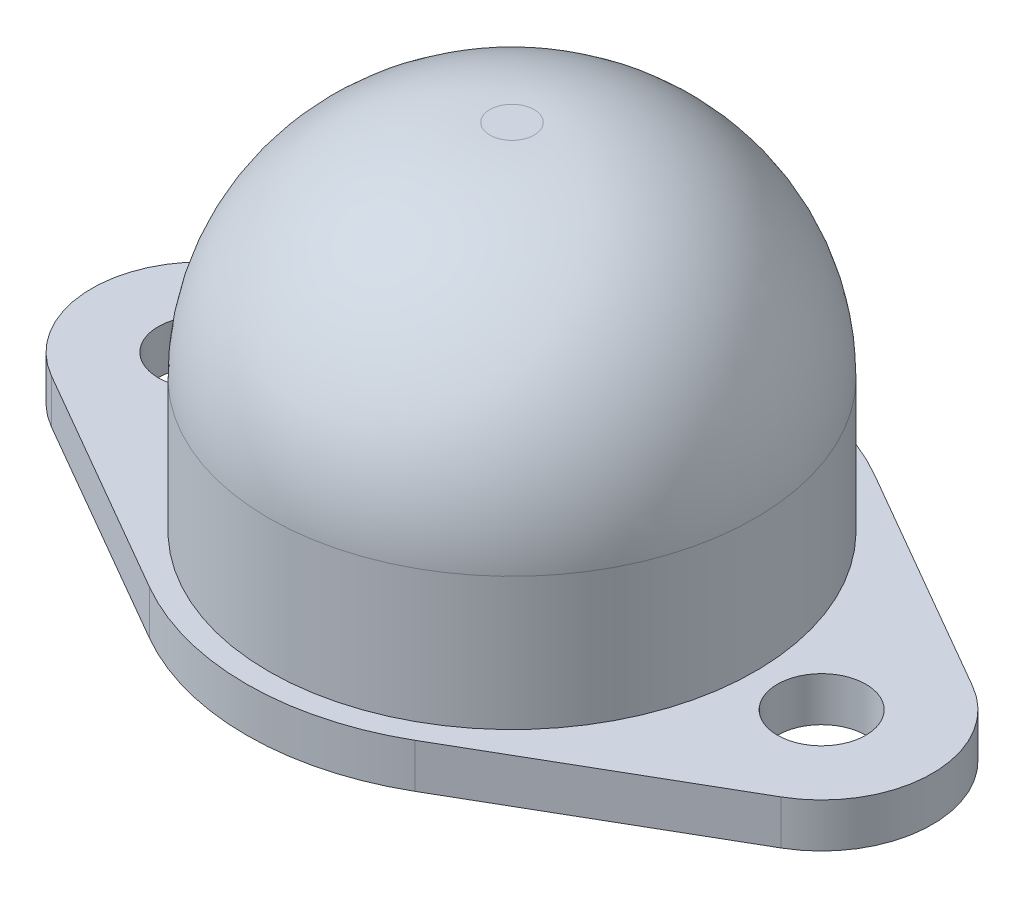
ISO-10303-21;
HEADER;
FILE_DESCRIPTION(('STEP AP214'),'2;1');
FILE_NAME('part.step','',(''),(''),'','','');
FILE_SCHEMA(('AUTOMOTIVE_DESIGN { 1 0 10303 214 1 1 1 1 }'));
ENDSEC;
DATA;
#1=APPLICATION_CONTEXT('core data for automotive mechanical design processes');
#2=APPLICATION_PROTOCOL_DEFINITION('international standard','automotive_design',2000,#1);
#3=PRODUCT_CONTEXT('',#1,'mechanical');
#4=PRODUCT('Part','Part','',(#3));
#5=PRODUCT_RELATED_PRODUCT_CATEGORY('part','',(#4));
#6=PRODUCT_DEFINITION_FORMATION('','',#4);
#7=PRODUCT_DEFINITION_CONTEXT('part definition',#1,'design');
#8=PRODUCT_DEFINITION('design','',#6,#7);
#9=PRODUCT_DEFINITION_SHAPE('','',#8);
#10=(LENGTH_UNIT() NAMED_UNIT(*) SI_UNIT(.MILLI.,.METRE.));
#11=(NAMED_UNIT(*) PLANE_ANGLE_UNIT() SI_UNIT($,.RADIAN.));
#12=(NAMED_UNIT(*) SI_UNIT($,.STERADIAN.) SOLID_ANGLE_UNIT());
#13=UNCERTAINTY_MEASURE_WITH_UNIT(LENGTH_MEASURE(1.E-05),#10,'distance_accuracy_value','');
#14=(GEOMETRIC_REPRESENTATION_CONTEXT(3) GLOBAL_UNCERTAINTY_ASSIGNED_CONTEXT((#13)) GLOBAL_UNIT_ASSIGNED_CONTEXT((#10,
#11,#12)) REPRESENTATION_CONTEXT('',''));
#15=CARTESIAN_POINT('',(0.,0.,0.));
#16=DIRECTION('',(0.,0.,1.));
#17=DIRECTION('',(1.,0.,0.));
#18=AXIS2_PLACEMENT_3D('',#15,#16,#17);
#19=CARTESIAN_POINT('',(3.,1.,5.19615242270663));
#20=DIRECTION('',(0.5,0.,0.866025403784439));
#21=DIRECTION('',(0.866025403784439,0.,-0.5));
#22=AXIS2_PLACEMENT_3D('',#19,#20,#21);
#23=PLANE('',#22);
#24=DIRECTION('',(-0.866025403784439,0.,0.5));
#25=VECTOR('',#24,1.);
#26=CARTESIAN_POINT('',(3.,0.,5.19615242270663));
#27=LINE('',#26,#25);
#28=CARTESIAN_POINT('',(8.25,0.,2.1650635094611));
#29=VERTEX_POINT('',#28);
#30=CARTESIAN_POINT('',(3.00000000000001,0.,5.19615242270663));
#31=VERTEX_POINT('',#30);
#32=EDGE_CURVE('E151',#29,#31,#27,.T.);
#33=ORIENTED_EDGE('',*,*,#32,.F.);
#34=DIRECTION('',(0.,-1.,0.));
#35=VECTOR('',#34,1.);
#36=CARTESIAN_POINT('',(8.25,1.,2.1650635094611));
#37=LINE('',#36,#35);
#38=CARTESIAN_POINT('',(8.25,1.,2.1650635094611));
#39=VERTEX_POINT('',#38);
#40=EDGE_CURVE('E98',#39,#29,#37,.T.);
#41=ORIENTED_EDGE('',*,*,#40,.F.);
#42=DIRECTION('',(-0.866025403784439,0.,0.5));
#43=VECTOR('',#42,1.);
#44=CARTESIAN_POINT('',(3.,1.,5.19615242270663));
#45=LINE('',#44,#43);
#46=CARTESIAN_POINT('',(3.00000000000001,1.,5.19615242270663));
#47=VERTEX_POINT('',#46);
#48=EDGE_CURVE('E187',#39,#47,#45,.T.);
#49=ORIENTED_EDGE('',*,*,#48,.T.);
#50=DIRECTION('',(0.,-1.,0.));
#51=VECTOR('',#50,1.);
#52=CARTESIAN_POINT('',(3.00000000000001,1.,5.19615242270663));
#53=LINE('',#52,#51);
#54=EDGE_CURVE('E94',#47,#31,#53,.T.);
#55=ORIENTED_EDGE('',*,*,#54,.T.);
#56=EDGE_LOOP('',(#33,#41,#49,#55));
#57=FACE_BOUND('',#56,.T.);
#58=ADVANCED_FACE('F41',(#57),#23,.T.);
#59=CARTESIAN_POINT('',(7.,1.,0.));
#60=DIRECTION('',(0.,-1.,0.));
#61=DIRECTION('',(0.,0.,-1.));
#62=AXIS2_PLACEMENT_3D('',#59,#60,#61);
#63=CYLINDRICAL_SURFACE('',#62,2.5);
#64=CARTESIAN_POINT('',(7.,0.,0.));
#65=DIRECTION('',(0.,1.,0.));
#66=DIRECTION('',(0.,0.,1.));
#67=AXIS2_PLACEMENT_3D('',#64,#65,#66);
#68=CIRCLE('',#67,2.5);
#69=CARTESIAN_POINT('',(8.25,0.,-2.1650635094611));
#70=VERTEX_POINT('',#69);
#71=EDGE_CURVE('E155',#29,#70,#68,.T.);
#72=ORIENTED_EDGE('',*,*,#71,.T.);
#73=DIRECTION('',(0.,-1.,0.));
#74=VECTOR('',#73,1.);
#75=CARTESIAN_POINT('',(8.25,1.,-2.1650635094611));
#76=LINE('',#75,#74);
#77=CARTESIAN_POINT('',(8.25,1.,-2.1650635094611));
#78=VERTEX_POINT('',#77);
#79=EDGE_CURVE('E200',#78,#70,#76,.T.);
#80=ORIENTED_EDGE('',*,*,#79,.F.);
#81=CARTESIAN_POINT('',(7.,1.,0.));
#82=DIRECTION('',(0.,1.,0.));
#83=DIRECTION('',(0.,0.,1.));
#84=AXIS2_PLACEMENT_3D('',#81,#82,#83);
#85=CIRCLE('',#84,2.5);
#86=EDGE_CURVE('E217',#39,#78,#85,.T.);
#87=ORIENTED_EDGE('',*,*,#86,.F.);
#88=ORIENTED_EDGE('',*,*,#40,.T.);
#89=EDGE_LOOP('',(#72,#80,#87,#88));
#90=FACE_BOUND('',#89,.T.);
#91=ADVANCED_FACE('F240',(#90),#63,.T.);
#92=CARTESIAN_POINT('',(3.,1.,-5.19615242270663));
#93=DIRECTION('',(0.5,0.,-0.866025403784439));
#94=DIRECTION('',(-0.866025403784439,0.,-0.5));
#95=AXIS2_PLACEMENT_3D('',#92,#93,#94);
#96=PLANE('',#95);
#97=DIRECTION('',(0.866025403784439,0.,0.5));
#98=VECTOR('',#97,1.);
#99=CARTESIAN_POINT('',(3.,0.,-5.19615242270663));
#100=LINE('',#99,#98);
#101=CARTESIAN_POINT('',(3.00000000000001,0.,-5.19615242270663));
#102=VERTEX_POINT('',#101);
#103=EDGE_CURVE('E159',#102,#70,#100,.T.);
#104=ORIENTED_EDGE('',*,*,#103,.F.);
#105=DIRECTION('',(0.,-1.,0.));
#106=VECTOR('',#105,1.);
#107=CARTESIAN_POINT('',(3.00000000000001,1.,-5.19615242270663));
#108=LINE('',#107,#106);
#109=CARTESIAN_POINT('',(3.00000000000001,1.,-5.19615242270663));
#110=VERTEX_POINT('',#109);
#111=EDGE_CURVE('E197',#110,#102,#108,.T.);
#112=ORIENTED_EDGE('',*,*,#111,.F.);
#113=DIRECTION('',(0.866025403784439,0.,0.5));
#114=VECTOR('',#113,1.);
#115=CARTESIAN_POINT('',(3.,1.,-5.19615242270663));
#116=LINE('',#115,#114);
#117=EDGE_CURVE('E220',#110,#78,#116,.T.);
#118=ORIENTED_EDGE('',*,*,#117,.T.);
#119=ORIENTED_EDGE('',*,*,#79,.T.);
#120=EDGE_LOOP('',(#104,#112,#118,#119));
#121=FACE_BOUND('',#120,.T.);
#122=ADVANCED_FACE('F243',(#121),#96,.T.);
#123=CARTESIAN_POINT('',(0.,1.,0.));
#124=DIRECTION('',(0.,-1.,0.));
#125=DIRECTION('',(0.,0.,-1.));
#126=AXIS2_PLACEMENT_3D('',#123,#124,#125);
#127=CYLINDRICAL_SURFACE('',#126,6.);
#128=CARTESIAN_POINT('',(0.,0.,0.));
#129=DIRECTION('',(0.,1.,0.));
#130=DIRECTION('',(0.,0.,1.));
#131=AXIS2_PLACEMENT_3D('',#128,#129,#130);
#132=CIRCLE('',#131,6.);
#133=CARTESIAN_POINT('',(-3.,0.,-5.19615242270663));
#134=VERTEX_POINT('',#133);
#135=EDGE_CURVE('E163',#102,#134,#132,.T.);
#136=ORIENTED_EDGE('',*,*,#135,.T.);
#137=DIRECTION('',(0.,-1.,0.));
#138=VECTOR('',#137,1.);
#139=CARTESIAN_POINT('',(-3.,1.,-5.19615242270663));
#140=LINE('',#139,#138);
#141=CARTESIAN_POINT('',(-3.,1.,-5.19615242270663));
#142=VERTEX_POINT('',#141);
#143=EDGE_CURVE('E194',#142,#134,#140,.T.);
#144=ORIENTED_EDGE('',*,*,#143,.F.);
#145=CARTESIAN_POINT('',(0.,1.,0.));
#146=DIRECTION('',(0.,1.,0.));
#147=DIRECTION('',(0.,0.,1.));
#148=AXIS2_PLACEMENT_3D('',#145,#146,#147);
#149=CIRCLE('',#148,6.);
#150=EDGE_CURVE('E224',#110,#142,#149,.T.);
#151=ORIENTED_EDGE('',*,*,#150,.F.);
#152=ORIENTED_EDGE('',*,*,#111,.T.);
#153=EDGE_LOOP('',(#136,#144,#151,#152));
#154=FACE_BOUND('',#153,.T.);
#155=ADVANCED_FACE('F246',(#154),#127,.T.);
#156=CARTESIAN_POINT('',(-3.,1.,-5.19615242270663));
#157=DIRECTION('',(-0.5,0.,-0.866025403784439));
#158=DIRECTION('',(-0.866025403784439,0.,0.5));
#159=AXIS2_PLACEMENT_3D('',#156,#157,#158);
#160=PLANE('',#159);
#161=DIRECTION('',(0.866025403784439,0.,-0.5));
#162=VECTOR('',#161,1.);
#163=CARTESIAN_POINT('',(-3.,0.,-5.19615242270663));
#164=LINE('',#163,#162);
#165=CARTESIAN_POINT('',(-8.25,0.,-2.1650635094611));
#166=VERTEX_POINT('',#165);
#167=EDGE_CURVE('E167',#166,#134,#164,.T.);
#168=ORIENTED_EDGE('',*,*,#167,.F.);
#169=DIRECTION('',(0.,-1.,0.));
#170=VECTOR('',#169,1.);
#171=CARTESIAN_POINT('',(-8.25,1.,-2.1650635094611));
#172=LINE('',#171,#170);
#173=CARTESIAN_POINT('',(-8.25,1.,-2.1650635094611));
#174=VERTEX_POINT('',#173);
#175=EDGE_CURVE('E134',#174,#166,#172,.T.);
#176=ORIENTED_EDGE('',*,*,#175,.F.);
#177=DIRECTION('',(0.866025403784439,0.,-0.5));
#178=VECTOR('',#177,1.);
#179=CARTESIAN_POINT('',(-3.,1.,-5.19615242270663));
#180=LINE('',#179,#178);
#181=EDGE_CURVE('E121',#174,#142,#180,.T.);
#182=ORIENTED_EDGE('',*,*,#181,.T.);
#183=ORIENTED_EDGE('',*,*,#143,.T.);
#184=EDGE_LOOP('',(#168,#176,#182,#183));
#185=FACE_BOUND('',#184,.T.);
#186=ADVANCED_FACE('F229',(#185),#160,.T.);
#187=CARTESIAN_POINT('',(-7.,1.,0.));
#188=DIRECTION('',(0.,-1.,0.));
#189=DIRECTION('',(0.,0.,-1.));
#190=AXIS2_PLACEMENT_3D('',#187,#188,#189);
#191=CYLINDRICAL_SURFACE('',#190,2.5);
#192=CARTESIAN_POINT('',(-7.,0.,0.));
#193=DIRECTION('',(0.,1.,0.));
#194=DIRECTION('',(0.,0.,1.));
#195=AXIS2_PLACEMENT_3D('',#192,#193,#194);
#196=CIRCLE('',#195,2.5);
#197=CARTESIAN_POINT('',(-8.25,0.,2.1650635094611));
#198=VERTEX_POINT('',#197);
#199=EDGE_CURVE('E129',#166,#198,#196,.T.);
#200=ORIENTED_EDGE('',*,*,#199,.T.);
#201=DIRECTION('',(0.,-1.,0.));
#202=VECTOR('',#201,1.);
#203=CARTESIAN_POINT('',(-8.25,1.,2.1650635094611));
#204=LINE('',#203,#202);
#205=CARTESIAN_POINT('',(-8.25,1.,2.1650635094611));
#206=VERTEX_POINT('',#205);
#207=EDGE_CURVE('E126',#206,#198,#204,.T.);
#208=ORIENTED_EDGE('',*,*,#207,.F.);
#209=CARTESIAN_POINT('',(-7.,1.,0.));
#210=DIRECTION('',(0.,1.,0.));
#211=DIRECTION('',(0.,0.,1.));
#212=AXIS2_PLACEMENT_3D('',#209,#210,#211);
#213=CIRCLE('',#212,2.5);
#214=EDGE_CURVE('E114',#174,#206,#213,.T.);
#215=ORIENTED_EDGE('',*,*,#214,.F.);
#216=ORIENTED_EDGE('',*,*,#175,.T.);
#217=EDGE_LOOP('',(#200,#208,#215,#216));
#218=FACE_BOUND('',#217,.T.);
#219=ADVANCED_FACE('F127',(#218),#191,.T.);
#220=CARTESIAN_POINT('',(-3.,1.,5.19615242270663));
#221=DIRECTION('',(-0.5,0.,0.866025403784439));
#222=DIRECTION('',(0.866025403784439,0.,0.5));
#223=AXIS2_PLACEMENT_3D('',#220,#221,#222);
#224=PLANE('',#223);
#225=DIRECTION('',(-0.866025403784439,0.,-0.5));
#226=VECTOR('',#225,1.);
#227=CARTESIAN_POINT('',(-3.,0.,5.19615242270663));
#228=LINE('',#227,#226);
#229=CARTESIAN_POINT('',(-3.00000000000001,0.,5.19615242270663));
#230=VERTEX_POINT('',#229);
#231=EDGE_CURVE('E173',#230,#198,#228,.T.);
#232=ORIENTED_EDGE('',*,*,#231,.F.);
#233=DIRECTION('',(0.,-1.,0.));
#234=VECTOR('',#233,1.);
#235=CARTESIAN_POINT('',(-3.00000000000001,1.,5.19615242270663));
#236=LINE('',#235,#234);
#237=CARTESIAN_POINT('',(-3.00000000000001,1.,5.19615242270663));
#238=VERTEX_POINT('',#237);
#239=EDGE_CURVE('E87',#238,#230,#236,.T.);
#240=ORIENTED_EDGE('',*,*,#239,.F.);
#241=DIRECTION('',(-0.866025403784439,0.,-0.5));
#242=VECTOR('',#241,1.);
#243=CARTESIAN_POINT('',(-3.,1.,5.19615242270663));
#244=LINE('',#243,#242);
#245=EDGE_CURVE('E119',#238,#206,#244,.T.);
#246=ORIENTED_EDGE('',*,*,#245,.T.);
#247=ORIENTED_EDGE('',*,*,#207,.T.);
#248=EDGE_LOOP('',(#232,#240,#246,#247));
#249=FACE_BOUND('',#248,.T.);
#250=ADVANCED_FACE('F136',(#249),#224,.T.);
#251=CARTESIAN_POINT('',(7.,1.,0.));
#252=DIRECTION('',(0.,-1.,0.));
#253=DIRECTION('',(0.,0.,-1.));
#254=AXIS2_PLACEMENT_3D('',#251,#252,#253);
#255=CYLINDRICAL_SURFACE('',#254,1.);
#256=CARTESIAN_POINT('',(7.,1.,0.));
#257=DIRECTION('',(0.,1.,0.));
#258=DIRECTION('',(0.,0.,1.));
#259=AXIS2_PLACEMENT_3D('',#256,#257,#258);
#260=CIRCLE('',#259,1.);
#261=CARTESIAN_POINT('',(7.,1.,1.));
#262=VERTEX_POINT('',#261);
#263=EDGE_CURVE('E140',#262,#262,#260,.T.);
#264=ORIENTED_EDGE('',*,*,#263,.T.);
#265=EDGE_LOOP('',(#264));
#266=FACE_BOUND('',#265,.T.);
#267=CARTESIAN_POINT('',(7.,0.,0.));
#268=DIRECTION('',(0.,1.,0.));
#269=DIRECTION('',(0.,0.,1.));
#270=AXIS2_PLACEMENT_3D('',#267,#268,#269);
#271=CIRCLE('',#270,1.);
#272=CARTESIAN_POINT('',(7.,0.,1.));
#273=VERTEX_POINT('',#272);
#274=EDGE_CURVE('E179',#273,#273,#271,.T.);
#275=ORIENTED_EDGE('',*,*,#274,.F.);
#276=EDGE_LOOP('',(#275));
#277=FACE_BOUND('',#276,.T.);
#278=ADVANCED_FACE('F293',(#266,#277),#255,.F.);
#279=CARTESIAN_POINT('',(0.,1.,0.));
#280=DIRECTION('',(0.,-1.,0.));
#281=DIRECTION('',(0.,0.,-1.));
#282=AXIS2_PLACEMENT_3D('',#279,#280,#281);
#283=CYLINDRICAL_SURFACE('',#282,6.);
#284=CARTESIAN_POINT('',(0.,0.,0.));
#285=DIRECTION('',(0.,1.,0.));
#286=DIRECTION('',(0.,0.,1.));
#287=AXIS2_PLACEMENT_3D('',#284,#285,#286);
#288=CIRCLE('',#287,6.);
#289=EDGE_CURVE('E176',#230,#31,#288,.T.);
#290=ORIENTED_EDGE('',*,*,#289,.T.);
#291=ORIENTED_EDGE('',*,*,#54,.F.);
#292=CARTESIAN_POINT('',(0.,1.,0.));
#293=DIRECTION('',(0.,1.,0.));
#294=DIRECTION('',(0.,0.,1.));
#295=AXIS2_PLACEMENT_3D('',#292,#293,#294);
#296=CIRCLE('',#295,6.);
#297=EDGE_CURVE('E59',#238,#47,#296,.T.);
#298=ORIENTED_EDGE('',*,*,#297,.F.);
#299=ORIENTED_EDGE('',*,*,#239,.T.);
#300=EDGE_LOOP('',(#290,#291,#298,#299));
#301=FACE_BOUND('',#300,.T.);
#302=ADVANCED_FACE('F236',(#301),#283,.T.);
#303=CARTESIAN_POINT('',(-7.,1.,0.));
#304=DIRECTION('',(0.,-1.,0.));
#305=DIRECTION('',(0.,0.,-1.));
#306=AXIS2_PLACEMENT_3D('',#303,#304,#305);
#307=CYLINDRICAL_SURFACE('',#306,1.);
#308=CARTESIAN_POINT('',(-7.,1.,0.));
#309=DIRECTION('',(0.,1.,0.));
#310=DIRECTION('',(0.,0.,1.));
#311=AXIS2_PLACEMENT_3D('',#308,#309,#310);
#312=CIRCLE('',#311,1.);
#313=CARTESIAN_POINT('',(-7.,1.,1.));
#314=VERTEX_POINT('',#313);
#315=EDGE_CURVE('E147',#314,#314,#312,.T.);
#316=ORIENTED_EDGE('',*,*,#315,.T.);
#317=EDGE_LOOP('',(#316));
#318=FACE_BOUND('',#317,.T.);
#319=CARTESIAN_POINT('',(-7.,0.,0.));
#320=DIRECTION('',(0.,1.,0.));
#321=DIRECTION('',(0.,0.,1.));
#322=AXIS2_PLACEMENT_3D('',#319,#320,#321);
#323=CIRCLE('',#322,1.);
#324=CARTESIAN_POINT('',(-7.,0.,1.));
#325=VERTEX_POINT('',#324);
#326=EDGE_CURVE('E183',#325,#325,#323,.T.);
#327=ORIENTED_EDGE('',*,*,#326,.F.);
#328=EDGE_LOOP('',(#327));
#329=FACE_BOUND('',#328,.T.);
#330=ADVANCED_FACE('F311',(#318,#329),#307,.F.);
#331=CARTESIAN_POINT('',(0.,1.,0.));
#332=DIRECTION('',(0.,1.,0.));
#333=DIRECTION('',(0.,0.,1.));
#334=AXIS2_PLACEMENT_3D('',#331,#332,#333);
#335=PLANE('',#334);
#336=CARTESIAN_POINT('',(0.,1.,0.));
#337=DIRECTION('',(0.,1.,0.));
#338=DIRECTION('',(0.,0.,1.));
#339=AXIS2_PLACEMENT_3D('',#336,#337,#338);
#340=CIRCLE('',#339,5.5);
#341=CARTESIAN_POINT('',(0.,1.,5.5));
#342=VERTEX_POINT('',#341);
#343=EDGE_CURVE('E204',#342,#342,#340,.T.);
#344=ORIENTED_EDGE('',*,*,#343,.F.);
#345=EDGE_LOOP('',(#344));
#346=FACE_BOUND('',#345,.T.);
#347=ORIENTED_EDGE('',*,*,#48,.F.);
#348=ORIENTED_EDGE('',*,*,#86,.T.);
#349=ORIENTED_EDGE('',*,*,#117,.F.);
#350=ORIENTED_EDGE('',*,*,#150,.T.);
#351=ORIENTED_EDGE('',*,*,#181,.F.);
#352=ORIENTED_EDGE('',*,*,#214,.T.);
#353=ORIENTED_EDGE('',*,*,#245,.F.);
#354=ORIENTED_EDGE('',*,*,#297,.T.);
#355=EDGE_LOOP('',(#347,#348,#349,#350,#351,#352,#353,#354));
#356=FACE_BOUND('',#355,.T.);
#357=ORIENTED_EDGE('',*,*,#263,.F.);
#358=EDGE_LOOP('',(#357));
#359=FACE_BOUND('',#358,.T.);
#360=ORIENTED_EDGE('',*,*,#315,.F.);
#361=EDGE_LOOP('',(#360));
#362=FACE_BOUND('',#361,.T.);
#363=ADVANCED_FACE('F116',(#346,#356,#359,#362),#335,.T.);
#364=CARTESIAN_POINT('',(0.,0.,0.));
#365=DIRECTION('',(0.,1.,0.));
#366=DIRECTION('',(0.,0.,1.));
#367=AXIS2_PLACEMENT_3D('',#364,#365,#366);
#368=PLANE('',#367);
#369=ORIENTED_EDGE('',*,*,#32,.T.);
#370=ORIENTED_EDGE('',*,*,#289,.F.);
#371=ORIENTED_EDGE('',*,*,#231,.T.);
#372=ORIENTED_EDGE('',*,*,#199,.F.);
#373=ORIENTED_EDGE('',*,*,#167,.T.);
#374=ORIENTED_EDGE('',*,*,#135,.F.);
#375=ORIENTED_EDGE('',*,*,#103,.T.);
#376=ORIENTED_EDGE('',*,*,#71,.F.);
#377=EDGE_LOOP('',(#369,#370,#371,#372,#373,#374,#375,#376));
#378=FACE_BOUND('',#377,.T.);
#379=ORIENTED_EDGE('',*,*,#274,.T.);
#380=EDGE_LOOP('',(#379));
#381=FACE_BOUND('',#380,.T.);
#382=ORIENTED_EDGE('',*,*,#326,.T.);
#383=EDGE_LOOP('',(#382));
#384=FACE_BOUND('',#383,.T.);
#385=ADVANCED_FACE('F232',(#378,#381,#384),#368,.F.);
#386=CARTESIAN_POINT('',(0.,9.,0.));
#387=DIRECTION('',(0.,-1.,0.));
#388=DIRECTION('',(0.,0.,-1.));
#389=AXIS2_PLACEMENT_3D('',#386,#387,#388);
#390=CYLINDRICAL_SURFACE('',#389,5.5);
#391=CARTESIAN_POINT('',(0.,4.,0.));
#392=DIRECTION('',(0.,1.,0.));
#393=DIRECTION('',(0.,0.,1.));
#394=AXIS2_PLACEMENT_3D('',#391,#392,#393);
#395=CIRCLE('',#394,5.5);
#396=CARTESIAN_POINT('',(0.,4.,5.5));
#397=VERTEX_POINT('',#396);
#398=EDGE_CURVE('E11',#397,#397,#395,.F.);
#399=ORIENTED_EDGE('',*,*,#398,.T.);
#400=EDGE_LOOP('',(#399));
#401=FACE_BOUND('',#400,.T.);
#402=ORIENTED_EDGE('',*,*,#343,.T.);
#403=EDGE_LOOP('',(#402));
#404=FACE_BOUND('',#403,.T.);
#405=ADVANCED_FACE('F331',(#401,#404),#390,.T.);
#406=CARTESIAN_POINT('',(0.,9.,0.));
#407=DIRECTION('',(0.,1.,0.));
#408=DIRECTION('',(0.,0.,1.));
#409=AXIS2_PLACEMENT_3D('',#406,#407,#408);
#410=PLANE('',#409);
#411=CARTESIAN_POINT('',(0.,9.,0.));
#412=DIRECTION('',(0.,1.,0.));
#413=DIRECTION('',(0.,0.,1.));
#414=AXIS2_PLACEMENT_3D('',#411,#412,#413);
#415=CIRCLE('',#414,0.5);
#416=CARTESIAN_POINT('',(0.,9.,0.5));
#417=VERTEX_POINT('',#416);
#418=EDGE_CURVE('E51',#417,#417,#415,.T.);
#419=ORIENTED_EDGE('',*,*,#418,.T.);
#420=EDGE_LOOP('',(#419));
#421=FACE_BOUND('',#420,.T.);
#422=ADVANCED_FACE('F351',(#421),#410,.T.);
#423=CARTESIAN_POINT('',(0.,4.,0.));
#424=DIRECTION('',(0.,1.,0.));
#425=DIRECTION('',(0.,0.,1.));
#426=AXIS2_PLACEMENT_3D('',#423,#424,#425);
#427=DEGENERATE_TOROIDAL_SURFACE('',#426,0.5,5.,.T.);
#428=ORIENTED_EDGE('',*,*,#398,.F.);
#429=EDGE_LOOP('',(#428));
#430=FACE_BOUND('',#429,.T.);
#431=ORIENTED_EDGE('',*,*,#418,.F.);
#432=EDGE_LOOP('',(#431));
#433=FACE_BOUND('',#432,.T.);
#434=ADVANCED_FACE('F43',(#430,#433),#427,.T.);
#435=CLOSED_SHELL('',(#58,#91,#122,#155,#186,#219,#250,#278,#302,#330,#363,#385,#405,#422,#434));
#436=MANIFOLD_SOLID_BREP('B2',#435);
#437=ADVANCED_BREP_SHAPE_REPRESENTATION('',(#18,#436),#14);
#438=SHAPE_DEFINITION_REPRESENTATION(#9,#437);
ENDSEC;
END-ISO-10303-21;
